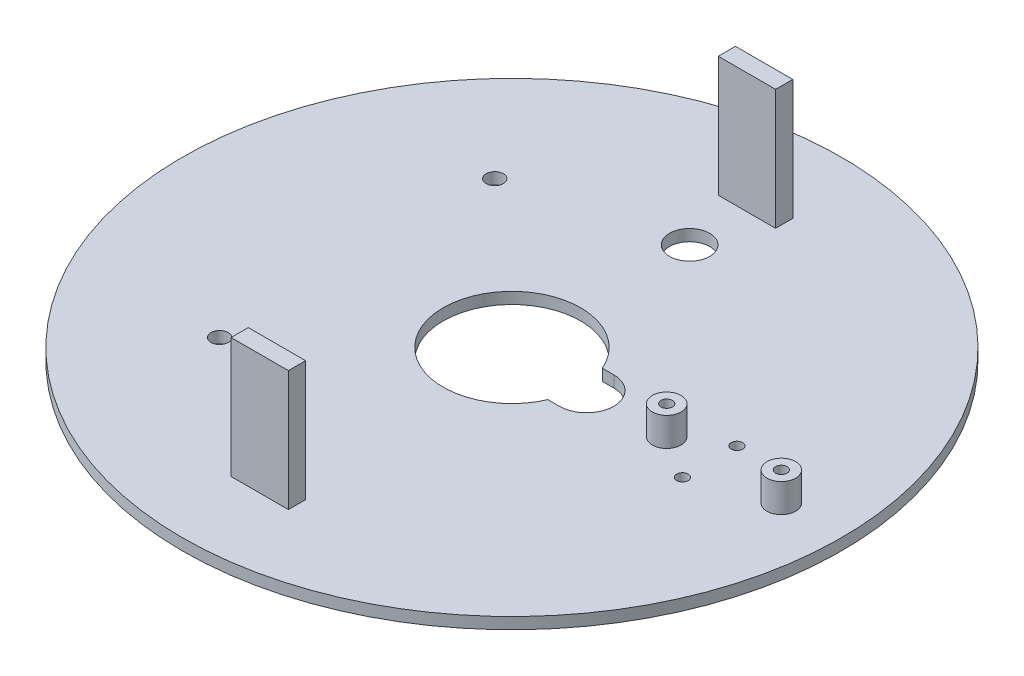
ISO-10303-21;
HEADER;
FILE_DESCRIPTION(('STEP AP214'),'2;1');
FILE_NAME('part.step','',(''),(''),'','','');
FILE_SCHEMA(('AUTOMOTIVE_DESIGN { 1 0 10303 214 1 1 1 1 }'));
ENDSEC;
DATA;
#1=APPLICATION_CONTEXT('core data for automotive mechanical design processes');
#2=APPLICATION_PROTOCOL_DEFINITION('international standard','automotive_design',2000,#1);
#3=PRODUCT_CONTEXT('',#1,'mechanical');
#4=PRODUCT('Part','Part','',(#3));
#5=PRODUCT_RELATED_PRODUCT_CATEGORY('part','',(#4));
#6=PRODUCT_DEFINITION_FORMATION('','',#4);
#7=PRODUCT_DEFINITION_CONTEXT('part definition',#1,'design');
#8=PRODUCT_DEFINITION('design','',#6,#7);
#9=PRODUCT_DEFINITION_SHAPE('','',#8);
#10=(LENGTH_UNIT() NAMED_UNIT(*) SI_UNIT(.MILLI.,.METRE.));
#11=(NAMED_UNIT(*) PLANE_ANGLE_UNIT() SI_UNIT($,.RADIAN.));
#12=(NAMED_UNIT(*) SI_UNIT($,.STERADIAN.) SOLID_ANGLE_UNIT());
#13=UNCERTAINTY_MEASURE_WITH_UNIT(LENGTH_MEASURE(1.E-05),#10,'distance_accuracy_value','');
#14=(GEOMETRIC_REPRESENTATION_CONTEXT(3) GLOBAL_UNCERTAINTY_ASSIGNED_CONTEXT((#13)) GLOBAL_UNIT_ASSIGNED_CONTEXT((#10,
#11,#12)) REPRESENTATION_CONTEXT('',''));
#15=CARTESIAN_POINT('',(0.,0.,0.));
#16=DIRECTION('',(0.,0.,1.));
#17=DIRECTION('',(1.,0.,0.));
#18=AXIS2_PLACEMENT_3D('',#15,#16,#17);
#19=CARTESIAN_POINT('',(0.,2.,0.));
#20=DIRECTION('',(0.,1.,0.));
#21=DIRECTION('',(0.,0.,1.));
#22=AXIS2_PLACEMENT_3D('',#19,#20,#21);
#23=PLANE('',#22);
#24=DIRECTION('',(1.,0.,0.));
#25=VECTOR('',#24,1.);
#26=CARTESIAN_POINT('',(11.0198684202671,2.,4.75));
#27=LINE('',#26,#25);
#28=CARTESIAN_POINT('',(11.0198684202671,2.,4.75));
#29=VERTEX_POINT('',#28);
#30=CARTESIAN_POINT('',(13.0198684202671,2.,4.75));
#31=VERTEX_POINT('',#30);
#32=EDGE_CURVE('E143',#29,#31,#27,.T.);
#33=ORIENTED_EDGE('',*,*,#32,.F.);
#34=CARTESIAN_POINT('',(0.,2.,0.));
#35=DIRECTION('',(0.,1.,0.));
#36=DIRECTION('',(0.,0.,1.));
#37=AXIS2_PLACEMENT_3D('',#34,#35,#36);
#38=CIRCLE('',#37,12.);
#39=CARTESIAN_POINT('',(11.0198684202671,2.,-4.75));
#40=VERTEX_POINT('',#39);
#41=EDGE_CURVE('E258',#40,#29,#38,.T.);
#42=ORIENTED_EDGE('',*,*,#41,.F.);
#43=DIRECTION('',(-1.,0.,0.));
#44=VECTOR('',#43,1.);
#45=CARTESIAN_POINT('',(13.0198684202671,2.,-4.75));
#46=LINE('',#45,#44);
#47=CARTESIAN_POINT('',(13.0198684202671,2.,-4.75));
#48=VERTEX_POINT('',#47);
#49=EDGE_CURVE('E48',#48,#40,#46,.T.);
#50=ORIENTED_EDGE('',*,*,#49,.F.);
#51=CARTESIAN_POINT('',(13.0198684202671,2.,0.));
#52=DIRECTION('',(0.,1.,0.));
#53=DIRECTION('',(0.,0.,-1.));
#54=AXIS2_PLACEMENT_3D('',#51,#52,#53);
#55=CIRCLE('',#54,4.75);
#56=EDGE_CURVE('E130',#31,#48,#55,.T.);
#57=ORIENTED_EDGE('',*,*,#56,.F.);
#58=EDGE_LOOP('',(#33,#42,#50,#57));
#59=FACE_BOUND('',#58,.T.);
#60=CARTESIAN_POINT('',(34.5,2.,-4.75));
#61=DIRECTION('',(0.,1.,0.));
#62=DIRECTION('',(0.,0.,1.));
#63=AXIS2_PLACEMENT_3D('',#60,#61,#62);
#64=CIRCLE('',#63,0.999999999999998);
#65=CARTESIAN_POINT('',(34.5,2.,-3.75));
#66=VERTEX_POINT('',#65);
#67=EDGE_CURVE('E148',#66,#66,#64,.T.);
#68=ORIENTED_EDGE('',*,*,#67,.F.);
#69=EDGE_LOOP('',(#68));
#70=FACE_BOUND('',#69,.T.);
#71=CARTESIAN_POINT('',(34.5,2.,4.75));
#72=DIRECTION('',(0.,1.,0.));
#73=DIRECTION('',(0.,0.,1.));
#74=AXIS2_PLACEMENT_3D('',#71,#72,#73);
#75=CIRCLE('',#74,0.999999999999998);
#76=CARTESIAN_POINT('',(34.5,2.,5.75));
#77=VERTEX_POINT('',#76);
#78=EDGE_CURVE('E163',#77,#77,#75,.T.);
#79=ORIENTED_EDGE('',*,*,#78,.F.);
#80=EDGE_LOOP('',(#79));
#81=FACE_BOUND('',#80,.T.);
#82=CARTESIAN_POINT('',(-27.,2.,-24.));
#83=DIRECTION('',(0.,1.,0.));
#84=DIRECTION('',(0.,0.,1.));
#85=AXIS2_PLACEMENT_3D('',#82,#83,#84);
#86=CIRCLE('',#85,1.5);
#87=CARTESIAN_POINT('',(-27.,2.,-22.5));
#88=VERTEX_POINT('',#87);
#89=EDGE_CURVE('E175',#88,#88,#86,.T.);
#90=ORIENTED_EDGE('',*,*,#89,.F.);
#91=EDGE_LOOP('',(#90));
#92=FACE_BOUND('',#91,.T.);
#93=CARTESIAN_POINT('',(-27.,2.,24.));
#94=DIRECTION('',(0.,1.,0.));
#95=DIRECTION('',(0.,0.,1.));
#96=AXIS2_PLACEMENT_3D('',#93,#94,#95);
#97=CIRCLE('',#96,1.5);
#98=CARTESIAN_POINT('',(-27.,2.,25.5));
#99=VERTEX_POINT('',#98);
#100=EDGE_CURVE('E170',#99,#99,#97,.T.);
#101=ORIENTED_EDGE('',*,*,#100,.F.);
#102=EDGE_LOOP('',(#101));
#103=FACE_BOUND('',#102,.T.);
#104=CARTESIAN_POINT('',(0.,2.,-31.));
#105=DIRECTION('',(0.,1.,0.));
#106=DIRECTION('',(0.,0.,1.));
#107=AXIS2_PLACEMENT_3D('',#104,#105,#106);
#108=CIRCLE('',#107,3.5);
#109=CARTESIAN_POINT('',(0.,2.,-27.5));
#110=VERTEX_POINT('',#109);
#111=EDGE_CURVE('E178',#110,#110,#108,.T.);
#112=ORIENTED_EDGE('',*,*,#111,.F.);
#113=EDGE_LOOP('',(#112));
#114=FACE_BOUND('',#113,.T.);
#115=CARTESIAN_POINT('',(47.,2.,0.));
#116=DIRECTION('',(0.,1.,0.));
#117=DIRECTION('',(0.,0.,1.));
#118=AXIS2_PLACEMENT_3D('',#115,#116,#117);
#119=CIRCLE('',#118,2.5);
#120=CARTESIAN_POINT('',(47.,2.,2.5));
#121=VERTEX_POINT('',#120);
#122=EDGE_CURVE('E187',#121,#121,#119,.T.);
#123=ORIENTED_EDGE('',*,*,#122,.F.);
#124=EDGE_LOOP('',(#123));
#125=FACE_BOUND('',#124,.T.);
#126=CARTESIAN_POINT('',(27.,2.,0.));
#127=DIRECTION('',(0.,1.,0.));
#128=DIRECTION('',(0.,0.,1.));
#129=AXIS2_PLACEMENT_3D('',#126,#127,#128);
#130=CIRCLE('',#129,2.5);
#131=CARTESIAN_POINT('',(27.,2.,2.5));
#132=VERTEX_POINT('',#131);
#133=EDGE_CURVE('E196',#132,#132,#130,.T.);
#134=ORIENTED_EDGE('',*,*,#133,.F.);
#135=EDGE_LOOP('',(#134));
#136=FACE_BOUND('',#135,.T.);
#137=CARTESIAN_POINT('',(0.,2.,0.));
#138=DIRECTION('',(0.,1.,0.));
#139=DIRECTION('',(0.,0.,1.));
#140=AXIS2_PLACEMENT_3D('',#137,#138,#139);
#141=CIRCLE('',#140,57.5);
#142=CARTESIAN_POINT('',(0.,2.,57.5));
#143=VERTEX_POINT('',#142);
#144=EDGE_CURVE('E262',#143,#143,#141,.T.);
#145=ORIENTED_EDGE('',*,*,#144,.T.);
#146=EDGE_LOOP('',(#145));
#147=FACE_BOUND('',#146,.T.);
#148=DIRECTION('',(1.,0.,0.));
#149=VECTOR('',#148,1.);
#150=CARTESIAN_POINT('',(-5.,2.,44.));
#151=LINE('',#150,#149);
#152=CARTESIAN_POINT('',(-5.,2.,44.));
#153=VERTEX_POINT('',#152);
#154=CARTESIAN_POINT('',(5.,2.,44.));
#155=VERTEX_POINT('',#154);
#156=EDGE_CURVE('E243',#153,#155,#151,.T.);
#157=ORIENTED_EDGE('',*,*,#156,.F.);
#158=DIRECTION('',(0.,0.,1.));
#159=VECTOR('',#158,1.);
#160=CARTESIAN_POINT('',(-5.,2.,44.));
#161=LINE('',#160,#159);
#162=CARTESIAN_POINT('',(-5.,2.,41.));
#163=VERTEX_POINT('',#162);
#164=EDGE_CURVE('E229',#163,#153,#161,.T.);
#165=ORIENTED_EDGE('',*,*,#164,.F.);
#166=DIRECTION('',(-1.,0.,0.));
#167=VECTOR('',#166,1.);
#168=CARTESIAN_POINT('',(-5.,2.,41.));
#169=LINE('',#168,#167);
#170=CARTESIAN_POINT('',(5.,2.,41.));
#171=VERTEX_POINT('',#170);
#172=EDGE_CURVE('E234',#171,#163,#169,.T.);
#173=ORIENTED_EDGE('',*,*,#172,.F.);
#174=DIRECTION('',(0.,0.,-1.));
#175=VECTOR('',#174,1.);
#176=CARTESIAN_POINT('',(5.,2.,44.));
#177=LINE('',#176,#175);
#178=EDGE_CURVE('E245',#155,#171,#177,.T.);
#179=ORIENTED_EDGE('',*,*,#178,.F.);
#180=EDGE_LOOP('',(#157,#165,#173,#179));
#181=FACE_BOUND('',#180,.T.);
#182=DIRECTION('',(1.,0.,0.));
#183=VECTOR('',#182,1.);
#184=CARTESIAN_POINT('',(-5.,2.,-41.));
#185=LINE('',#184,#183);
#186=CARTESIAN_POINT('',(-5.,2.,-41.));
#187=VERTEX_POINT('',#186);
#188=CARTESIAN_POINT('',(5.,2.,-41.));
#189=VERTEX_POINT('',#188);
#190=EDGE_CURVE('E216',#187,#189,#185,.T.);
#191=ORIENTED_EDGE('',*,*,#190,.F.);
#192=DIRECTION('',(0.,0.,1.));
#193=VECTOR('',#192,1.);
#194=CARTESIAN_POINT('',(-5.,2.,-44.));
#195=LINE('',#194,#193);
#196=CARTESIAN_POINT('',(-5.,2.,-44.));
#197=VERTEX_POINT('',#196);
#198=EDGE_CURVE('E200',#197,#187,#195,.T.);
#199=ORIENTED_EDGE('',*,*,#198,.F.);
#200=DIRECTION('',(-1.,0.,0.));
#201=VECTOR('',#200,1.);
#202=CARTESIAN_POINT('',(-5.,2.,-44.));
#203=LINE('',#202,#201);
#204=CARTESIAN_POINT('',(5.,2.,-44.));
#205=VERTEX_POINT('',#204);
#206=EDGE_CURVE('E207',#205,#197,#203,.T.);
#207=ORIENTED_EDGE('',*,*,#206,.F.);
#208=DIRECTION('',(0.,0.,-1.));
#209=VECTOR('',#208,1.);
#210=CARTESIAN_POINT('',(5.,2.,-44.));
#211=LINE('',#210,#209);
#212=EDGE_CURVE('E218',#189,#205,#211,.T.);
#213=ORIENTED_EDGE('',*,*,#212,.F.);
#214=EDGE_LOOP('',(#191,#199,#207,#213));
#215=FACE_BOUND('',#214,.T.);
#216=ADVANCED_FACE('F33',(#59,#70,#81,#92,#103,#114,#125,#136,#147,#181,#215),#23,.T.);
#217=CARTESIAN_POINT('',(0.,2.,0.));
#218=DIRECTION('',(0.,-1.,0.));
#219=DIRECTION('',(0.,0.,-1.));
#220=AXIS2_PLACEMENT_3D('',#217,#218,#219);
#221=CYLINDRICAL_SURFACE('',#220,57.5);
#222=ORIENTED_EDGE('',*,*,#144,.F.);
#223=EDGE_LOOP('',(#222));
#224=FACE_BOUND('',#223,.T.);
#225=CARTESIAN_POINT('',(0.,0.,0.));
#226=DIRECTION('',(0.,1.,0.));
#227=DIRECTION('',(0.,0.,1.));
#228=AXIS2_PLACEMENT_3D('',#225,#226,#227);
#229=CIRCLE('',#228,57.5);
#230=CARTESIAN_POINT('',(0.,0.,57.5));
#231=VERTEX_POINT('',#230);
#232=EDGE_CURVE('E265',#231,#231,#229,.T.);
#233=ORIENTED_EDGE('',*,*,#232,.T.);
#234=EDGE_LOOP('',(#233));
#235=FACE_BOUND('',#234,.T.);
#236=ADVANCED_FACE('F35',(#224,#235),#221,.T.);
#237=CARTESIAN_POINT('',(0.,0.,0.));
#238=DIRECTION('',(0.,1.,0.));
#239=DIRECTION('',(0.,0.,1.));
#240=AXIS2_PLACEMENT_3D('',#237,#238,#239);
#241=PLANE('',#240);
#242=CARTESIAN_POINT('',(34.5,0.,-4.75));
#243=DIRECTION('',(0.,1.,0.));
#244=DIRECTION('',(0.,0.,1.));
#245=AXIS2_PLACEMENT_3D('',#242,#243,#244);
#246=CIRCLE('',#245,0.999999999999998);
#247=CARTESIAN_POINT('',(34.5,0.,-3.75));
#248=VERTEX_POINT('',#247);
#249=EDGE_CURVE('E166',#248,#248,#246,.T.);
#250=ORIENTED_EDGE('',*,*,#249,.T.);
#251=EDGE_LOOP('',(#250));
#252=FACE_BOUND('',#251,.T.);
#253=CARTESIAN_POINT('',(34.5,0.,4.75));
#254=DIRECTION('',(0.,1.,0.));
#255=DIRECTION('',(0.,0.,1.));
#256=AXIS2_PLACEMENT_3D('',#253,#254,#255);
#257=CIRCLE('',#256,0.999999999999998);
#258=CARTESIAN_POINT('',(34.5,0.,5.75));
#259=VERTEX_POINT('',#258);
#260=EDGE_CURVE('E159',#259,#259,#257,.T.);
#261=ORIENTED_EDGE('',*,*,#260,.T.);
#262=EDGE_LOOP('',(#261));
#263=FACE_BOUND('',#262,.T.);
#264=CARTESIAN_POINT('',(-27.,0.,-24.));
#265=DIRECTION('',(0.,1.,0.));
#266=DIRECTION('',(0.,0.,1.));
#267=AXIS2_PLACEMENT_3D('',#264,#265,#266);
#268=CIRCLE('',#267,1.5);
#269=CARTESIAN_POINT('',(-27.,0.,-22.5));
#270=VERTEX_POINT('',#269);
#271=EDGE_CURVE('E167',#270,#270,#268,.T.);
#272=ORIENTED_EDGE('',*,*,#271,.T.);
#273=EDGE_LOOP('',(#272));
#274=FACE_BOUND('',#273,.T.);
#275=CARTESIAN_POINT('',(-27.,0.,24.));
#276=DIRECTION('',(0.,1.,0.));
#277=DIRECTION('',(0.,0.,1.));
#278=AXIS2_PLACEMENT_3D('',#275,#276,#277);
#279=CIRCLE('',#278,1.5);
#280=CARTESIAN_POINT('',(-27.,0.,25.5));
#281=VERTEX_POINT('',#280);
#282=EDGE_CURVE('E162',#281,#281,#279,.T.);
#283=ORIENTED_EDGE('',*,*,#282,.T.);
#284=EDGE_LOOP('',(#283));
#285=FACE_BOUND('',#284,.T.);
#286=CARTESIAN_POINT('',(0.,0.,-31.));
#287=DIRECTION('',(0.,1.,0.));
#288=DIRECTION('',(0.,0.,1.));
#289=AXIS2_PLACEMENT_3D('',#286,#287,#288);
#290=CIRCLE('',#289,3.5);
#291=CARTESIAN_POINT('',(0.,0.,-27.5));
#292=VERTEX_POINT('',#291);
#293=EDGE_CURVE('E179',#292,#292,#290,.T.);
#294=ORIENTED_EDGE('',*,*,#293,.T.);
#295=EDGE_LOOP('',(#294));
#296=FACE_BOUND('',#295,.T.);
#297=CARTESIAN_POINT('',(0.,0.,0.));
#298=DIRECTION('',(0.,1.,0.));
#299=DIRECTION('',(0.,0.,1.));
#300=AXIS2_PLACEMENT_3D('',#297,#298,#299);
#301=CIRCLE('',#300,12.);
#302=CARTESIAN_POINT('',(11.0198684202671,0.,-4.75));
#303=VERTEX_POINT('',#302);
#304=CARTESIAN_POINT('',(11.0198684202671,0.,4.75));
#305=VERTEX_POINT('',#304);
#306=EDGE_CURVE('E261',#303,#305,#301,.T.);
#307=ORIENTED_EDGE('',*,*,#306,.T.);
#308=DIRECTION('',(1.,0.,0.));
#309=VECTOR('',#308,1.);
#310=CARTESIAN_POINT('',(11.0198684202671,0.,4.75));
#311=LINE('',#310,#309);
#312=CARTESIAN_POINT('',(13.0198684202671,0.,4.75));
#313=VERTEX_POINT('',#312);
#314=EDGE_CURVE('E132',#305,#313,#311,.T.);
#315=ORIENTED_EDGE('',*,*,#314,.T.);
#316=CARTESIAN_POINT('',(13.0198684202671,0.,0.));
#317=DIRECTION('',(0.,1.,0.));
#318=DIRECTION('',(0.,0.,-1.));
#319=AXIS2_PLACEMENT_3D('',#316,#317,#318);
#320=CIRCLE('',#319,4.75);
#321=CARTESIAN_POINT('',(13.0198684202671,0.,-4.75));
#322=VERTEX_POINT('',#321);
#323=EDGE_CURVE('E127',#313,#322,#320,.T.);
#324=ORIENTED_EDGE('',*,*,#323,.T.);
#325=DIRECTION('',(-1.,0.,0.));
#326=VECTOR('',#325,1.);
#327=CARTESIAN_POINT('',(13.0198684202671,0.,-4.75));
#328=LINE('',#327,#326);
#329=EDGE_CURVE('E135',#322,#303,#328,.T.);
#330=ORIENTED_EDGE('',*,*,#329,.T.);
#331=EDGE_LOOP('',(#307,#315,#324,#330));
#332=FACE_BOUND('',#331,.T.);
#333=ORIENTED_EDGE('',*,*,#232,.F.);
#334=EDGE_LOOP('',(#333));
#335=FACE_BOUND('',#334,.T.);
#336=ADVANCED_FACE('F141',(#252,#263,#274,#285,#296,#332,#335),#241,.F.);
#337=CARTESIAN_POINT('',(0.,-1.,0.));
#338=DIRECTION('',(0.,1.,0.));
#339=DIRECTION('',(0.,0.,1.));
#340=AXIS2_PLACEMENT_3D('',#337,#338,#339);
#341=CYLINDRICAL_SURFACE('',#340,12.);
#342=ORIENTED_EDGE('',*,*,#41,.T.);
#343=DIRECTION('',(0.,1.,0.));
#344=VECTOR('',#343,1.);
#345=CARTESIAN_POINT('',(11.0198684202671,0.,4.75));
#346=LINE('',#345,#344);
#347=EDGE_CURVE('E156',#305,#29,#346,.T.);
#348=ORIENTED_EDGE('',*,*,#347,.F.);
#349=ORIENTED_EDGE('',*,*,#306,.F.);
#350=DIRECTION('',(0.,1.,0.));
#351=VECTOR('',#350,1.);
#352=CARTESIAN_POINT('',(11.0198684202671,0.,-4.75));
#353=LINE('',#352,#351);
#354=EDGE_CURVE('E131',#303,#40,#353,.T.);
#355=ORIENTED_EDGE('',*,*,#354,.T.);
#356=EDGE_LOOP('',(#342,#348,#349,#355));
#357=FACE_BOUND('',#356,.T.);
#358=ADVANCED_FACE('F357',(#357),#341,.F.);
#359=CARTESIAN_POINT('',(-5.,23.,44.));
#360=DIRECTION('',(1.,0.,0.));
#361=DIRECTION('',(0.,0.,-1.));
#362=AXIS2_PLACEMENT_3D('',#359,#360,#361);
#363=PLANE('',#362);
#364=ORIENTED_EDGE('',*,*,#164,.T.);
#365=DIRECTION('',(0.,-1.,0.));
#366=VECTOR('',#365,1.);
#367=CARTESIAN_POINT('',(-5.,23.,44.));
#368=LINE('',#367,#366);
#369=CARTESIAN_POINT('',(-5.,23.,44.));
#370=VERTEX_POINT('',#369);
#371=EDGE_CURVE('E256',#370,#153,#368,.T.);
#372=ORIENTED_EDGE('',*,*,#371,.F.);
#373=DIRECTION('',(0.,0.,1.));
#374=VECTOR('',#373,1.);
#375=CARTESIAN_POINT('',(-5.,23.,44.));
#376=LINE('',#375,#374);
#377=CARTESIAN_POINT('',(-5.,23.,41.));
#378=VERTEX_POINT('',#377);
#379=EDGE_CURVE('E230',#378,#370,#376,.T.);
#380=ORIENTED_EDGE('',*,*,#379,.F.);
#381=DIRECTION('',(0.,-1.,0.));
#382=VECTOR('',#381,1.);
#383=CARTESIAN_POINT('',(-5.,23.,41.));
#384=LINE('',#383,#382);
#385=EDGE_CURVE('E240',#378,#163,#384,.T.);
#386=ORIENTED_EDGE('',*,*,#385,.T.);
#387=EDGE_LOOP('',(#364,#372,#380,#386));
#388=FACE_BOUND('',#387,.T.);
#389=ADVANCED_FACE('F354',(#388),#363,.F.);
#390=CARTESIAN_POINT('',(-5.,23.,44.));
#391=DIRECTION('',(0.,0.,-1.));
#392=DIRECTION('',(-1.,0.,0.));
#393=AXIS2_PLACEMENT_3D('',#390,#391,#392);
#394=PLANE('',#393);
#395=ORIENTED_EDGE('',*,*,#156,.T.);
#396=DIRECTION('',(0.,-1.,0.));
#397=VECTOR('',#396,1.);
#398=CARTESIAN_POINT('',(5.,23.,44.));
#399=LINE('',#398,#397);
#400=CARTESIAN_POINT('',(5.,23.,44.));
#401=VERTEX_POINT('',#400);
#402=EDGE_CURVE('E253',#401,#155,#399,.T.);
#403=ORIENTED_EDGE('',*,*,#402,.F.);
#404=DIRECTION('',(1.,0.,0.));
#405=VECTOR('',#404,1.);
#406=CARTESIAN_POINT('',(-5.,23.,44.));
#407=LINE('',#406,#405);
#408=EDGE_CURVE('E233',#370,#401,#407,.T.);
#409=ORIENTED_EDGE('',*,*,#408,.F.);
#410=ORIENTED_EDGE('',*,*,#371,.T.);
#411=EDGE_LOOP('',(#395,#403,#409,#410));
#412=FACE_BOUND('',#411,.T.);
#413=ADVANCED_FACE('F350',(#412),#394,.F.);
#414=CARTESIAN_POINT('',(5.,23.,44.));
#415=DIRECTION('',(-1.,0.,0.));
#416=DIRECTION('',(0.,0.,1.));
#417=AXIS2_PLACEMENT_3D('',#414,#415,#416);
#418=PLANE('',#417);
#419=ORIENTED_EDGE('',*,*,#178,.T.);
#420=DIRECTION('',(0.,-1.,0.));
#421=VECTOR('',#420,1.);
#422=CARTESIAN_POINT('',(5.,23.,41.));
#423=LINE('',#422,#421);
#424=CARTESIAN_POINT('',(5.,23.,41.));
#425=VERTEX_POINT('',#424);
#426=EDGE_CURVE('E251',#425,#171,#423,.T.);
#427=ORIENTED_EDGE('',*,*,#426,.F.);
#428=DIRECTION('',(0.,0.,-1.));
#429=VECTOR('',#428,1.);
#430=CARTESIAN_POINT('',(5.,23.,44.));
#431=LINE('',#430,#429);
#432=EDGE_CURVE('E236',#401,#425,#431,.T.);
#433=ORIENTED_EDGE('',*,*,#432,.F.);
#434=ORIENTED_EDGE('',*,*,#402,.T.);
#435=EDGE_LOOP('',(#419,#427,#433,#434));
#436=FACE_BOUND('',#435,.T.);
#437=ADVANCED_FACE('F346',(#436),#418,.F.);
#438=CARTESIAN_POINT('',(-5.,23.,41.));
#439=DIRECTION('',(0.,0.,1.));
#440=DIRECTION('',(1.,0.,0.));
#441=AXIS2_PLACEMENT_3D('',#438,#439,#440);
#442=PLANE('',#441);
#443=ORIENTED_EDGE('',*,*,#172,.T.);
#444=ORIENTED_EDGE('',*,*,#385,.F.);
#445=DIRECTION('',(-1.,0.,0.));
#446=VECTOR('',#445,1.);
#447=CARTESIAN_POINT('',(-5.,23.,41.));
#448=LINE('',#447,#446);
#449=EDGE_CURVE('E238',#425,#378,#448,.T.);
#450=ORIENTED_EDGE('',*,*,#449,.F.);
#451=ORIENTED_EDGE('',*,*,#426,.T.);
#452=EDGE_LOOP('',(#443,#444,#450,#451));
#453=FACE_BOUND('',#452,.T.);
#454=ADVANCED_FACE('F342',(#453),#442,.F.);
#455=CARTESIAN_POINT('',(0.,23.,0.));
#456=DIRECTION('',(0.,-1.,0.));
#457=DIRECTION('',(0.,0.,-1.));
#458=AXIS2_PLACEMENT_3D('',#455,#456,#457);
#459=PLANE('',#458);
#460=ORIENTED_EDGE('',*,*,#379,.T.);
#461=ORIENTED_EDGE('',*,*,#408,.T.);
#462=ORIENTED_EDGE('',*,*,#432,.T.);
#463=ORIENTED_EDGE('',*,*,#449,.T.);
#464=EDGE_LOOP('',(#460,#461,#462,#463));
#465=FACE_BOUND('',#464,.T.);
#466=ADVANCED_FACE('F338',(#465),#459,.F.);
#467=CARTESIAN_POINT('',(-5.,23.,-44.));
#468=DIRECTION('',(1.,0.,0.));
#469=DIRECTION('',(0.,0.,-1.));
#470=AXIS2_PLACEMENT_3D('',#467,#468,#469);
#471=PLANE('',#470);
#472=ORIENTED_EDGE('',*,*,#198,.T.);
#473=DIRECTION('',(0.,-1.,0.));
#474=VECTOR('',#473,1.);
#475=CARTESIAN_POINT('',(-5.,23.,-41.));
#476=LINE('',#475,#474);
#477=CARTESIAN_POINT('',(-5.,23.,-41.));
#478=VERTEX_POINT('',#477);
#479=EDGE_CURVE('E227',#478,#187,#476,.T.);
#480=ORIENTED_EDGE('',*,*,#479,.F.);
#481=DIRECTION('',(0.,0.,1.));
#482=VECTOR('',#481,1.);
#483=CARTESIAN_POINT('',(-5.,23.,-44.));
#484=LINE('',#483,#482);
#485=CARTESIAN_POINT('',(-5.,23.,-44.));
#486=VERTEX_POINT('',#485);
#487=EDGE_CURVE('E203',#486,#478,#484,.T.);
#488=ORIENTED_EDGE('',*,*,#487,.F.);
#489=DIRECTION('',(0.,-1.,0.));
#490=VECTOR('',#489,1.);
#491=CARTESIAN_POINT('',(-5.,23.,-44.));
#492=LINE('',#491,#490);
#493=EDGE_CURVE('E213',#486,#197,#492,.T.);
#494=ORIENTED_EDGE('',*,*,#493,.T.);
#495=EDGE_LOOP('',(#472,#480,#488,#494));
#496=FACE_BOUND('',#495,.T.);
#497=ADVANCED_FACE('F334',(#496),#471,.F.);
#498=CARTESIAN_POINT('',(-5.,23.,-41.));
#499=DIRECTION('',(0.,0.,-1.));
#500=DIRECTION('',(-1.,0.,0.));
#501=AXIS2_PLACEMENT_3D('',#498,#499,#500);
#502=PLANE('',#501);
#503=ORIENTED_EDGE('',*,*,#190,.T.);
#504=DIRECTION('',(0.,-1.,0.));
#505=VECTOR('',#504,1.);
#506=CARTESIAN_POINT('',(5.,23.,-41.));
#507=LINE('',#506,#505);
#508=CARTESIAN_POINT('',(5.,23.,-41.));
#509=VERTEX_POINT('',#508);
#510=EDGE_CURVE('E224',#509,#189,#507,.T.);
#511=ORIENTED_EDGE('',*,*,#510,.F.);
#512=DIRECTION('',(1.,0.,0.));
#513=VECTOR('',#512,1.);
#514=CARTESIAN_POINT('',(-5.,23.,-41.));
#515=LINE('',#514,#513);
#516=EDGE_CURVE('E206',#478,#509,#515,.T.);
#517=ORIENTED_EDGE('',*,*,#516,.F.);
#518=ORIENTED_EDGE('',*,*,#479,.T.);
#519=EDGE_LOOP('',(#503,#511,#517,#518));
#520=FACE_BOUND('',#519,.T.);
#521=ADVANCED_FACE('F330',(#520),#502,.F.);
#522=CARTESIAN_POINT('',(5.,23.,-44.));
#523=DIRECTION('',(-1.,0.,0.));
#524=DIRECTION('',(0.,0.,1.));
#525=AXIS2_PLACEMENT_3D('',#522,#523,#524);
#526=PLANE('',#525);
#527=ORIENTED_EDGE('',*,*,#212,.T.);
#528=DIRECTION('',(0.,-1.,0.));
#529=VECTOR('',#528,1.);
#530=CARTESIAN_POINT('',(5.,23.,-44.));
#531=LINE('',#530,#529);
#532=CARTESIAN_POINT('',(5.,23.,-44.));
#533=VERTEX_POINT('',#532);
#534=EDGE_CURVE('E56',#533,#205,#531,.T.);
#535=ORIENTED_EDGE('',*,*,#534,.F.);
#536=DIRECTION('',(0.,0.,-1.));
#537=VECTOR('',#536,1.);
#538=CARTESIAN_POINT('',(5.,23.,-44.));
#539=LINE('',#538,#537);
#540=EDGE_CURVE('E209',#509,#533,#539,.T.);
#541=ORIENTED_EDGE('',*,*,#540,.F.);
#542=ORIENTED_EDGE('',*,*,#510,.T.);
#543=EDGE_LOOP('',(#527,#535,#541,#542));
#544=FACE_BOUND('',#543,.T.);
#545=ADVANCED_FACE('F327',(#544),#526,.F.);
#546=CARTESIAN_POINT('',(-5.,23.,-44.));
#547=DIRECTION('',(0.,0.,1.));
#548=DIRECTION('',(1.,0.,0.));
#549=AXIS2_PLACEMENT_3D('',#546,#547,#548);
#550=PLANE('',#549);
#551=ORIENTED_EDGE('',*,*,#206,.T.);
#552=ORIENTED_EDGE('',*,*,#493,.F.);
#553=DIRECTION('',(-1.,0.,0.));
#554=VECTOR('',#553,1.);
#555=CARTESIAN_POINT('',(-5.,23.,-44.));
#556=LINE('',#555,#554);
#557=EDGE_CURVE('E211',#533,#486,#556,.T.);
#558=ORIENTED_EDGE('',*,*,#557,.F.);
#559=ORIENTED_EDGE('',*,*,#534,.T.);
#560=EDGE_LOOP('',(#551,#552,#558,#559));
#561=FACE_BOUND('',#560,.T.);
#562=ADVANCED_FACE('F323',(#561),#550,.F.);
#563=CARTESIAN_POINT('',(0.,23.,0.));
#564=DIRECTION('',(0.,1.,0.));
#565=DIRECTION('',(0.,0.,1.));
#566=AXIS2_PLACEMENT_3D('',#563,#564,#565);
#567=PLANE('',#566);
#568=ORIENTED_EDGE('',*,*,#487,.T.);
#569=ORIENTED_EDGE('',*,*,#516,.T.);
#570=ORIENTED_EDGE('',*,*,#540,.T.);
#571=ORIENTED_EDGE('',*,*,#557,.T.);
#572=EDGE_LOOP('',(#568,#569,#570,#571));
#573=FACE_BOUND('',#572,.T.);
#574=ADVANCED_FACE('F316',(#573),#567,.T.);
#575=CARTESIAN_POINT('',(27.,7.,0.));
#576=DIRECTION('',(0.,1.,0.));
#577=DIRECTION('',(0.,0.,1.));
#578=AXIS2_PLACEMENT_3D('',#575,#576,#577);
#579=PLANE('',#578);
#580=CARTESIAN_POINT('',(27.,7.,0.));
#581=DIRECTION('',(0.,1.,0.));
#582=DIRECTION('',(0.,0.,1.));
#583=AXIS2_PLACEMENT_3D('',#580,#581,#582);
#584=CIRCLE('',#583,2.5);
#585=CARTESIAN_POINT('',(27.,7.,2.5));
#586=VERTEX_POINT('',#585);
#587=EDGE_CURVE('E197',#586,#586,#584,.T.);
#588=ORIENTED_EDGE('',*,*,#587,.T.);
#589=EDGE_LOOP('',(#588));
#590=FACE_BOUND('',#589,.T.);
#591=CARTESIAN_POINT('',(27.,7.,0.));
#592=DIRECTION('',(0.,1.,0.));
#593=DIRECTION('',(0.,0.,1.));
#594=AXIS2_PLACEMENT_3D('',#591,#592,#593);
#595=CIRCLE('',#594,0.999999999999998);
#596=CARTESIAN_POINT('',(27.,7.,0.999999999999998));
#597=VERTEX_POINT('',#596);
#598=EDGE_CURVE('E191',#597,#597,#595,.T.);
#599=ORIENTED_EDGE('',*,*,#598,.F.);
#600=EDGE_LOOP('',(#599));
#601=FACE_BOUND('',#600,.T.);
#602=ADVANCED_FACE('F313',(#590,#601),#579,.T.);
#603=CARTESIAN_POINT('',(27.,7.,0.));
#604=DIRECTION('',(0.,-1.,0.));
#605=DIRECTION('',(0.,0.,-1.));
#606=AXIS2_PLACEMENT_3D('',#603,#604,#605);
#607=CYLINDRICAL_SURFACE('',#606,2.5);
#608=ORIENTED_EDGE('',*,*,#587,.F.);
#609=EDGE_LOOP('',(#608));
#610=FACE_BOUND('',#609,.T.);
#611=ORIENTED_EDGE('',*,*,#133,.T.);
#612=EDGE_LOOP('',(#611));
#613=FACE_BOUND('',#612,.T.);
#614=ADVANCED_FACE('F285',(#610,#613),#607,.T.);
#615=CARTESIAN_POINT('',(27.,7.,0.));
#616=DIRECTION('',(0.,-1.,0.));
#617=DIRECTION('',(0.,0.,-1.));
#618=AXIS2_PLACEMENT_3D('',#615,#616,#617);
#619=CYLINDRICAL_SURFACE('',#618,0.999999999999998);
#620=ORIENTED_EDGE('',*,*,#598,.T.);
#621=EDGE_LOOP('',(#620));
#622=FACE_BOUND('',#621,.T.);
#623=CARTESIAN_POINT('',(27.,2.,0.));
#624=DIRECTION('',(0.,1.,0.));
#625=DIRECTION('',(0.,0.,1.));
#626=AXIS2_PLACEMENT_3D('',#623,#624,#625);
#627=CIRCLE('',#626,0.999999999999998);
#628=CARTESIAN_POINT('',(27.,2.,0.999999999999998));
#629=VERTEX_POINT('',#628);
#630=EDGE_CURVE('E41',#629,#629,#627,.F.);
#631=ORIENTED_EDGE('',*,*,#630,.T.);
#632=EDGE_LOOP('',(#631));
#633=FACE_BOUND('',#632,.T.);
#634=ADVANCED_FACE('F271',(#622,#633),#619,.F.);
#635=ORIENTED_EDGE('',*,*,#630,.F.);
#636=EDGE_LOOP('',(#635));
#637=FACE_BOUND('',#636,.T.);
#638=ADVANCED_FACE('F273',(#637),#23,.T.);
#639=CARTESIAN_POINT('',(47.,7.,0.));
#640=DIRECTION('',(0.,1.,0.));
#641=DIRECTION('',(0.,0.,1.));
#642=AXIS2_PLACEMENT_3D('',#639,#640,#641);
#643=PLANE('',#642);
#644=CARTESIAN_POINT('',(47.,7.,0.));
#645=DIRECTION('',(0.,1.,0.));
#646=DIRECTION('',(0.,0.,1.));
#647=AXIS2_PLACEMENT_3D('',#644,#645,#646);
#648=CIRCLE('',#647,2.5);
#649=CARTESIAN_POINT('',(47.,7.,2.5));
#650=VERTEX_POINT('',#649);
#651=EDGE_CURVE('E188',#650,#650,#648,.T.);
#652=ORIENTED_EDGE('',*,*,#651,.T.);
#653=EDGE_LOOP('',(#652));
#654=FACE_BOUND('',#653,.T.);
#655=CARTESIAN_POINT('',(47.,7.,0.));
#656=DIRECTION('',(0.,1.,0.));
#657=DIRECTION('',(0.,0.,1.));
#658=AXIS2_PLACEMENT_3D('',#655,#656,#657);
#659=CIRCLE('',#658,0.999999999999998);
#660=CARTESIAN_POINT('',(47.,7.,0.999999999999998));
#661=VERTEX_POINT('',#660);
#662=EDGE_CURVE('E182',#661,#661,#659,.T.);
#663=ORIENTED_EDGE('',*,*,#662,.F.);
#664=EDGE_LOOP('',(#663));
#665=FACE_BOUND('',#664,.T.);
#666=ADVANCED_FACE('F275',(#654,#665),#643,.T.);
#667=CARTESIAN_POINT('',(47.,7.,0.));
#668=DIRECTION('',(0.,-1.,0.));
#669=DIRECTION('',(0.,0.,-1.));
#670=AXIS2_PLACEMENT_3D('',#667,#668,#669);
#671=CYLINDRICAL_SURFACE('',#670,2.5);
#672=ORIENTED_EDGE('',*,*,#651,.F.);
#673=EDGE_LOOP('',(#672));
#674=FACE_BOUND('',#673,.T.);
#675=ORIENTED_EDGE('',*,*,#122,.T.);
#676=EDGE_LOOP('',(#675));
#677=FACE_BOUND('',#676,.T.);
#678=ADVANCED_FACE('F282',(#674,#677),#671,.T.);
#679=CARTESIAN_POINT('',(47.,7.,0.));
#680=DIRECTION('',(0.,-1.,0.));
#681=DIRECTION('',(0.,0.,-1.));
#682=AXIS2_PLACEMENT_3D('',#679,#680,#681);
#683=CYLINDRICAL_SURFACE('',#682,0.999999999999998);
#684=ORIENTED_EDGE('',*,*,#662,.T.);
#685=EDGE_LOOP('',(#684));
#686=FACE_BOUND('',#685,.T.);
#687=CARTESIAN_POINT('',(47.,2.,0.));
#688=DIRECTION('',(0.,1.,0.));
#689=DIRECTION('',(0.,0.,1.));
#690=AXIS2_PLACEMENT_3D('',#687,#688,#689);
#691=CIRCLE('',#690,0.999999999999998);
#692=CARTESIAN_POINT('',(47.,2.,0.999999999999998));
#693=VERTEX_POINT('',#692);
#694=EDGE_CURVE('E11',#693,#693,#691,.F.);
#695=ORIENTED_EDGE('',*,*,#694,.T.);
#696=EDGE_LOOP('',(#695));
#697=FACE_BOUND('',#696,.T.);
#698=ADVANCED_FACE('F293',(#686,#697),#683,.F.);
#699=ORIENTED_EDGE('',*,*,#694,.F.);
#700=EDGE_LOOP('',(#699));
#701=FACE_BOUND('',#700,.T.);
#702=ADVANCED_FACE('F277',(#701),#23,.T.);
#703=CARTESIAN_POINT('',(0.,0.,-31.));
#704=DIRECTION('',(0.,1.,0.));
#705=DIRECTION('',(0.,0.,1.));
#706=AXIS2_PLACEMENT_3D('',#703,#704,#705);
#707=CYLINDRICAL_SURFACE('',#706,3.5);
#708=ORIENTED_EDGE('',*,*,#293,.F.);
#709=EDGE_LOOP('',(#708));
#710=FACE_BOUND('',#709,.T.);
#711=ORIENTED_EDGE('',*,*,#111,.T.);
#712=EDGE_LOOP('',(#711));
#713=FACE_BOUND('',#712,.T.);
#714=ADVANCED_FACE('F292',(#710,#713),#707,.F.);
#715=CARTESIAN_POINT('',(-27.,0.,24.));
#716=DIRECTION('',(0.,1.,0.));
#717=DIRECTION('',(0.,0.,1.));
#718=AXIS2_PLACEMENT_3D('',#715,#716,#717);
#719=CYLINDRICAL_SURFACE('',#718,1.5);
#720=ORIENTED_EDGE('',*,*,#100,.T.);
#721=EDGE_LOOP('',(#720));
#722=FACE_BOUND('',#721,.T.);
#723=ORIENTED_EDGE('',*,*,#282,.F.);
#724=EDGE_LOOP('',(#723));
#725=FACE_BOUND('',#724,.T.);
#726=ADVANCED_FACE('F299',(#722,#725),#719,.F.);
#727=CARTESIAN_POINT('',(-27.,0.,-24.));
#728=DIRECTION('',(0.,1.,0.));
#729=DIRECTION('',(0.,0.,1.));
#730=AXIS2_PLACEMENT_3D('',#727,#728,#729);
#731=CYLINDRICAL_SURFACE('',#730,1.5);
#732=ORIENTED_EDGE('',*,*,#89,.T.);
#733=EDGE_LOOP('',(#732));
#734=FACE_BOUND('',#733,.T.);
#735=ORIENTED_EDGE('',*,*,#271,.F.);
#736=EDGE_LOOP('',(#735));
#737=FACE_BOUND('',#736,.T.);
#738=ADVANCED_FACE('F379',(#734,#737),#731,.F.);
#739=CARTESIAN_POINT('',(13.0198684202671,0.,0.));
#740=DIRECTION('',(0.,1.,0.));
#741=DIRECTION('',(0.,0.,1.));
#742=AXIS2_PLACEMENT_3D('',#739,#740,#741);
#743=CYLINDRICAL_SURFACE('',#742,4.75);
#744=ORIENTED_EDGE('',*,*,#56,.T.);
#745=DIRECTION('',(0.,1.,0.));
#746=VECTOR('',#745,1.);
#747=CARTESIAN_POINT('',(13.0198684202671,0.,-4.75));
#748=LINE('',#747,#746);
#749=EDGE_CURVE('E123',#322,#48,#748,.T.);
#750=ORIENTED_EDGE('',*,*,#749,.F.);
#751=ORIENTED_EDGE('',*,*,#323,.F.);
#752=DIRECTION('',(0.,1.,0.));
#753=VECTOR('',#752,1.);
#754=CARTESIAN_POINT('',(13.0198684202671,0.,4.75));
#755=LINE('',#754,#753);
#756=EDGE_CURVE('E154',#313,#31,#755,.T.);
#757=ORIENTED_EDGE('',*,*,#756,.T.);
#758=EDGE_LOOP('',(#744,#750,#751,#757));
#759=FACE_BOUND('',#758,.T.);
#760=ADVANCED_FACE('F125',(#759),#743,.F.);
#761=CARTESIAN_POINT('',(11.0198684202671,0.,4.75));
#762=DIRECTION('',(0.,0.,1.));
#763=DIRECTION('',(1.,0.,0.));
#764=AXIS2_PLACEMENT_3D('',#761,#762,#763);
#765=PLANE('',#764);
#766=ORIENTED_EDGE('',*,*,#32,.T.);
#767=ORIENTED_EDGE('',*,*,#756,.F.);
#768=ORIENTED_EDGE('',*,*,#314,.F.);
#769=ORIENTED_EDGE('',*,*,#347,.T.);
#770=EDGE_LOOP('',(#766,#767,#768,#769));
#771=FACE_BOUND('',#770,.T.);
#772=ADVANCED_FACE('F370',(#771),#765,.F.);
#773=CARTESIAN_POINT('',(13.0198684202671,0.,-4.75));
#774=DIRECTION('',(0.,0.,-1.));
#775=DIRECTION('',(-1.,0.,0.));
#776=AXIS2_PLACEMENT_3D('',#773,#774,#775);
#777=PLANE('',#776);
#778=ORIENTED_EDGE('',*,*,#49,.T.);
#779=ORIENTED_EDGE('',*,*,#354,.F.);
#780=ORIENTED_EDGE('',*,*,#329,.F.);
#781=ORIENTED_EDGE('',*,*,#749,.T.);
#782=EDGE_LOOP('',(#778,#779,#780,#781));
#783=FACE_BOUND('',#782,.T.);
#784=ADVANCED_FACE('F136',(#783),#777,.F.);
#785=CARTESIAN_POINT('',(34.5,0.,4.75));
#786=DIRECTION('',(0.,1.,0.));
#787=DIRECTION('',(0.,0.,1.));
#788=AXIS2_PLACEMENT_3D('',#785,#786,#787);
#789=CYLINDRICAL_SURFACE('',#788,0.999999999999998);
#790=ORIENTED_EDGE('',*,*,#260,.F.);
#791=EDGE_LOOP('',(#790));
#792=FACE_BOUND('',#791,.T.);
#793=ORIENTED_EDGE('',*,*,#78,.T.);
#794=EDGE_LOOP('',(#793));
#795=FACE_BOUND('',#794,.T.);
#796=ADVANCED_FACE('F377',(#792,#795),#789,.F.);
#797=CARTESIAN_POINT('',(34.5,0.,-4.75));
#798=DIRECTION('',(0.,1.,0.));
#799=DIRECTION('',(0.,0.,1.));
#800=AXIS2_PLACEMENT_3D('',#797,#798,#799);
#801=CYLINDRICAL_SURFACE('',#800,0.999999999999998);
#802=ORIENTED_EDGE('',*,*,#249,.F.);
#803=EDGE_LOOP('',(#802));
#804=FACE_BOUND('',#803,.T.);
#805=ORIENTED_EDGE('',*,*,#67,.T.);
#806=EDGE_LOOP('',(#805));
#807=FACE_BOUND('',#806,.T.);
#808=ADVANCED_FACE('F382',(#804,#807),#801,.F.);
#809=CLOSED_SHELL('',(#216,#236,#336,#358,#389,#413,#437,#454,#466,#497,#521,#545,#562,#574,
#602,#614,#634,#638,#666,#678,#698,#702,#714,#726,#738,#760,#772,#784,#796,#808));
#810=MANIFOLD_SOLID_BREP('B2',#809);
#811=ADVANCED_BREP_SHAPE_REPRESENTATION('',(#18,#810),#14);
#812=SHAPE_DEFINITION_REPRESENTATION(#9,#811);
ENDSEC;
END-ISO-10303-21;
